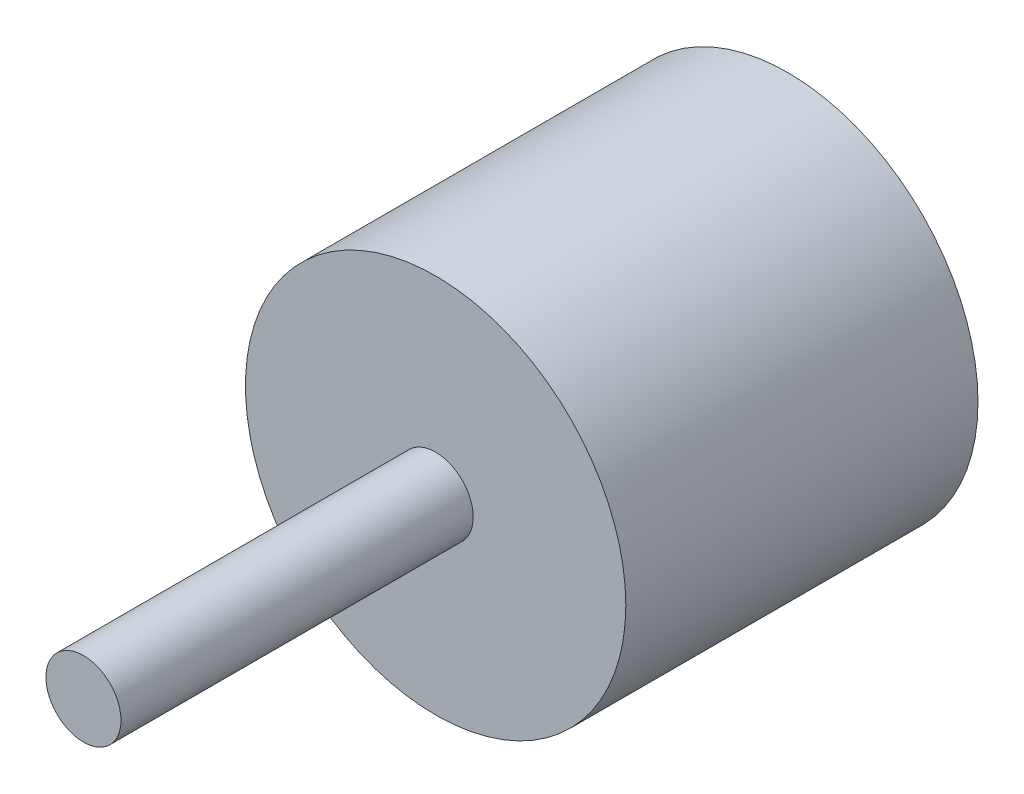
ISO-10303-21;
HEADER;
FILE_DESCRIPTION(('STEP AP214'),'2;1');
FILE_NAME('part.step','',(''),(''),'','','');
FILE_SCHEMA(('AUTOMOTIVE_DESIGN { 1 0 10303 214 1 1 1 1 }'));
ENDSEC;
DATA;
#1=APPLICATION_CONTEXT('core data for automotive mechanical design processes');
#2=APPLICATION_PROTOCOL_DEFINITION('international standard','automotive_design',2000,#1);
#3=PRODUCT_CONTEXT('',#1,'mechanical');
#4=PRODUCT('Part','Part','',(#3));
#5=PRODUCT_RELATED_PRODUCT_CATEGORY('part','',(#4));
#6=PRODUCT_DEFINITION_FORMATION('','',#4);
#7=PRODUCT_DEFINITION_CONTEXT('part definition',#1,'design');
#8=PRODUCT_DEFINITION('design','',#6,#7);
#9=PRODUCT_DEFINITION_SHAPE('','',#8);
#10=(LENGTH_UNIT() NAMED_UNIT(*) SI_UNIT(.MILLI.,.METRE.));
#11=(NAMED_UNIT(*) PLANE_ANGLE_UNIT() SI_UNIT($,.RADIAN.));
#12=(NAMED_UNIT(*) SI_UNIT($,.STERADIAN.) SOLID_ANGLE_UNIT());
#13=UNCERTAINTY_MEASURE_WITH_UNIT(LENGTH_MEASURE(1.E-05),#10,'distance_accuracy_value','');
#14=(GEOMETRIC_REPRESENTATION_CONTEXT(3) GLOBAL_UNCERTAINTY_ASSIGNED_CONTEXT((#13)) GLOBAL_UNIT_ASSIGNED_CONTEXT((#10,
#11,#12)) REPRESENTATION_CONTEXT('',''));
#15=CARTESIAN_POINT('',(0.,0.,0.));
#16=DIRECTION('',(0.,0.,1.));
#17=DIRECTION('',(1.,0.,0.));
#18=AXIS2_PLACEMENT_3D('',#15,#16,#17);
#19=CARTESIAN_POINT('',(0.,0.,50.));
#20=DIRECTION('',(0.,0.,-1.));
#21=DIRECTION('',(-1.,0.,0.));
#22=AXIS2_PLACEMENT_3D('',#19,#20,#21);
#23=CYLINDRICAL_SURFACE('',#22,26.9981872419761);
#24=CARTESIAN_POINT('',(0.,0.,50.));
#25=DIRECTION('',(0.,0.,1.));
#26=DIRECTION('',(1.,0.,0.));
#27=AXIS2_PLACEMENT_3D('',#24,#25,#26);
#28=CIRCLE('',#27,26.9981872419761);
#29=CARTESIAN_POINT('',(26.9981872419761,0.,50.));
#30=VERTEX_POINT('',#29);
#31=EDGE_CURVE('E51',#30,#30,#28,.T.);
#32=ORIENTED_EDGE('',*,*,#31,.F.);
#33=EDGE_LOOP('',(#32));
#34=FACE_BOUND('',#33,.T.);
#35=CARTESIAN_POINT('',(0.,0.,0.));
#36=DIRECTION('',(0.,0.,1.));
#37=DIRECTION('',(1.,0.,0.));
#38=AXIS2_PLACEMENT_3D('',#35,#36,#37);
#39=CIRCLE('',#38,26.9981872419761);
#40=CARTESIAN_POINT('',(26.9981872419761,0.,0.));
#41=VERTEX_POINT('',#40);
#42=EDGE_CURVE('E46',#41,#41,#39,.T.);
#43=ORIENTED_EDGE('',*,*,#42,.T.);
#44=EDGE_LOOP('',(#43));
#45=FACE_BOUND('',#44,.T.);
#46=ADVANCED_FACE('F43',(#34,#45),#23,.T.);
#47=CARTESIAN_POINT('',(0.,0.,50.));
#48=DIRECTION('',(0.,0.,1.));
#49=DIRECTION('',(1.,0.,0.));
#50=AXIS2_PLACEMENT_3D('',#47,#48,#49);
#51=PLANE('',#50);
#52=CARTESIAN_POINT('',(0.,0.,50.));
#53=DIRECTION('',(0.,0.,1.));
#54=DIRECTION('',(1.,0.,0.));
#55=AXIS2_PLACEMENT_3D('',#52,#53,#54);
#56=CIRCLE('',#55,5.32903847949203);
#57=CARTESIAN_POINT('',(5.32903847949203,0.,50.));
#58=VERTEX_POINT('',#57);
#59=EDGE_CURVE('E10',#58,#58,#56,.T.);
#60=ORIENTED_EDGE('',*,*,#59,.F.);
#61=EDGE_LOOP('',(#60));
#62=FACE_BOUND('',#61,.T.);
#63=ORIENTED_EDGE('',*,*,#31,.T.);
#64=EDGE_LOOP('',(#63));
#65=FACE_BOUND('',#64,.T.);
#66=ADVANCED_FACE('F71',(#62,#65),#51,.T.);
#67=CARTESIAN_POINT('',(0.,0.,0.));
#68=DIRECTION('',(0.,0.,1.));
#69=DIRECTION('',(1.,0.,0.));
#70=AXIS2_PLACEMENT_3D('',#67,#68,#69);
#71=PLANE('',#70);
#72=ORIENTED_EDGE('',*,*,#42,.F.);
#73=EDGE_LOOP('',(#72));
#74=FACE_BOUND('',#73,.T.);
#75=ADVANCED_FACE('F68',(#74),#71,.F.);
#76=CARTESIAN_POINT('',(0.,0.,100.));
#77=DIRECTION('',(0.,0.,-1.));
#78=DIRECTION('',(-1.,0.,0.));
#79=AXIS2_PLACEMENT_3D('',#76,#77,#78);
#80=CYLINDRICAL_SURFACE('',#79,5.32903847949203);
#81=CARTESIAN_POINT('',(0.,0.,100.));
#82=DIRECTION('',(0.,0.,1.));
#83=DIRECTION('',(1.,0.,0.));
#84=AXIS2_PLACEMENT_3D('',#81,#82,#83);
#85=CIRCLE('',#84,5.32903847949203);
#86=CARTESIAN_POINT('',(5.32903847949203,0.,100.));
#87=VERTEX_POINT('',#86);
#88=EDGE_CURVE('E58',#87,#87,#85,.T.);
#89=ORIENTED_EDGE('',*,*,#88,.F.);
#90=EDGE_LOOP('',(#89));
#91=FACE_BOUND('',#90,.T.);
#92=ORIENTED_EDGE('',*,*,#59,.T.);
#93=EDGE_LOOP('',(#92));
#94=FACE_BOUND('',#93,.T.);
#95=ADVANCED_FACE('F70',(#91,#94),#80,.T.);
#96=CARTESIAN_POINT('',(0.,0.,100.));
#97=DIRECTION('',(0.,0.,1.));
#98=DIRECTION('',(1.,0.,0.));
#99=AXIS2_PLACEMENT_3D('',#96,#97,#98);
#100=PLANE('',#99);
#101=ORIENTED_EDGE('',*,*,#88,.T.);
#102=EDGE_LOOP('',(#101));
#103=FACE_BOUND('',#102,.T.);
#104=ADVANCED_FACE('F77',(#103),#100,.T.);
#105=CLOSED_SHELL('',(#46,#66,#75,#95,#104));
#106=MANIFOLD_SOLID_BREP('B2',#105);
#107=ADVANCED_BREP_SHAPE_REPRESENTATION('',(#18,#106),#14);
#108=SHAPE_DEFINITION_REPRESENTATION(#9,#107);
ENDSEC;
END-ISO-10303-21;
